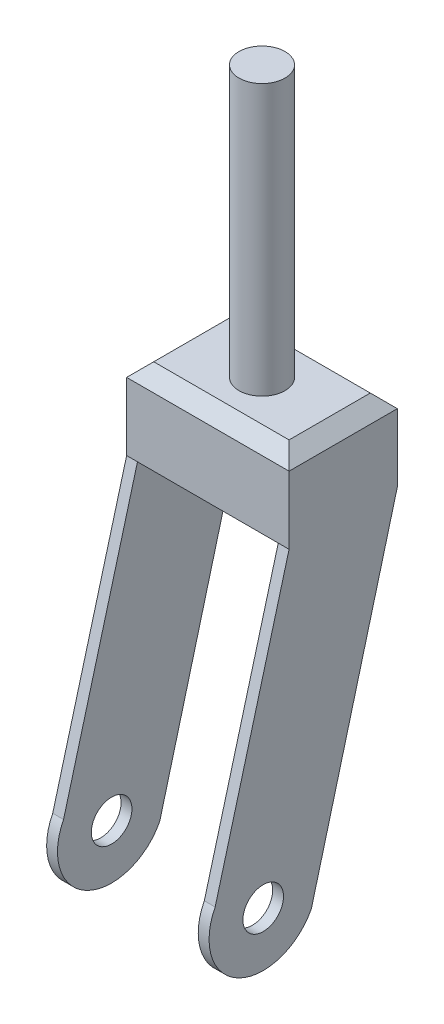
ISO-10303-21;
HEADER;
FILE_DESCRIPTION(('STEP AP214'),'2;1');
FILE_NAME('part.step','',(''),(''),'','','');
FILE_SCHEMA(('AUTOMOTIVE_DESIGN { 1 0 10303 214 1 1 1 1 }'));
ENDSEC;
DATA;
#1=APPLICATION_CONTEXT('core data for automotive mechanical design processes');
#2=APPLICATION_PROTOCOL_DEFINITION('international standard','automotive_design',2000,#1);
#3=PRODUCT_CONTEXT('',#1,'mechanical');
#4=PRODUCT('Part','Part','',(#3));
#5=PRODUCT_RELATED_PRODUCT_CATEGORY('part','',(#4));
#6=PRODUCT_DEFINITION_FORMATION('','',#4);
#7=PRODUCT_DEFINITION_CONTEXT('part definition',#1,'design');
#8=PRODUCT_DEFINITION('design','',#6,#7);
#9=PRODUCT_DEFINITION_SHAPE('','',#8);
#10=(LENGTH_UNIT() NAMED_UNIT(*) SI_UNIT(.MILLI.,.METRE.));
#11=(NAMED_UNIT(*) PLANE_ANGLE_UNIT() SI_UNIT($,.RADIAN.));
#12=(NAMED_UNIT(*) SI_UNIT($,.STERADIAN.) SOLID_ANGLE_UNIT());
#13=UNCERTAINTY_MEASURE_WITH_UNIT(LENGTH_MEASURE(1.E-05),#10,'distance_accuracy_value','');
#14=(GEOMETRIC_REPRESENTATION_CONTEXT(3) GLOBAL_UNCERTAINTY_ASSIGNED_CONTEXT((#13)) GLOBAL_UNIT_ASSIGNED_CONTEXT((#10,
#11,#12)) REPRESENTATION_CONTEXT('',''));
#15=CARTESIAN_POINT('',(0.,0.,0.));
#16=DIRECTION('',(0.,0.,1.));
#17=DIRECTION('',(1.,0.,0.));
#18=AXIS2_PLACEMENT_3D('',#15,#16,#17);
#19=CARTESIAN_POINT('',(-30.,-43.7583335370617,-8.10934535902268));
#20=DIRECTION('',(1.,0.,0.));
#21=DIRECTION('',(0.,0.,-1.));
#22=AXIS2_PLACEMENT_3D('',#19,#20,#21);
#23=CYLINDRICAL_SURFACE('',#22,20.);
#24=DIRECTION('',(1.,0.,0.));
#25=VECTOR('',#24,1.);
#26=CARTESIAN_POINT('',(-30.,-52.9685249966109,-25.8624401111623));
#27=LINE('',#26,#25);
#28=CARTESIAN_POINT('',(-30.,-52.9685249966109,-25.8624401111623));
#29=VERTEX_POINT('',#28);
#30=CARTESIAN_POINT('',(-26.,-52.9685249966109,-25.8624401111623));
#31=VERTEX_POINT('',#30);
#32=EDGE_CURVE('E180',#29,#31,#27,.T.);
#33=ORIENTED_EDGE('',*,*,#32,.T.);
#34=CARTESIAN_POINT('',(-26.,-43.7583335370617,-8.10934535902268));
#35=DIRECTION('',(-1.,0.,0.));
#36=DIRECTION('',(0.,-1.,0.));
#37=AXIS2_PLACEMENT_3D('',#34,#35,#36);
#38=CIRCLE('',#37,20.);
#39=CARTESIAN_POINT('',(-26.,-34.5481420775125,9.64374939311694));
#40=VERTEX_POINT('',#39);
#41=EDGE_CURVE('E366',#40,#31,#38,.F.);
#42=ORIENTED_EDGE('',*,*,#41,.F.);
#43=DIRECTION('',(1.,0.,0.));
#44=VECTOR('',#43,1.);
#45=CARTESIAN_POINT('',(-30.,-34.5481420775125,9.64374939311694));
#46=LINE('',#45,#44);
#47=CARTESIAN_POINT('',(-30.,-34.5481420775125,9.64374939311694));
#48=VERTEX_POINT('',#47);
#49=EDGE_CURVE('E203',#48,#40,#46,.T.);
#50=ORIENTED_EDGE('',*,*,#49,.F.);
#51=CARTESIAN_POINT('',(-30.,-43.7583335370617,-8.10934535902268));
#52=DIRECTION('',(1.,0.,0.));
#53=DIRECTION('',(0.,0.,-1.));
#54=AXIS2_PLACEMENT_3D('',#51,#52,#53);
#55=CIRCLE('',#54,20.);
#56=EDGE_CURVE('E336',#48,#29,#55,.T.);
#57=ORIENTED_EDGE('',*,*,#56,.T.);
#58=EDGE_LOOP('',(#33,#42,#50,#57));
#59=FACE_BOUND('',#58,.T.);
#60=ADVANCED_FACE('F47',(#59),#23,.T.);
#61=CARTESIAN_POINT('',(-30.,-34.5481420775125,9.64374939311694));
#62=DIRECTION('',(0.,0.261495189546313,0.965204779227775));
#63=DIRECTION('',(0.,-0.965204779227775,0.261495189546313));
#64=AXIS2_PLACEMENT_3D('',#61,#62,#63);
#65=PLANE('',#64);
#66=DIRECTION('',(0.,0.965204779227775,-0.261495189546313));
#67=VECTOR('',#66,1.);
#68=CARTESIAN_POINT('',(26.,-34.5481420775125,9.64374939311694));
#69=LINE('',#68,#67);
#70=CARTESIAN_POINT('',(26.,-34.5481420775125,9.64374939311694));
#71=VERTEX_POINT('',#70);
#72=CARTESIAN_POINT('',(26.,66.2416664629383,-17.6624250641918));
#73=VERTEX_POINT('',#72);
#74=EDGE_CURVE('E150',#71,#73,#69,.T.);
#75=ORIENTED_EDGE('',*,*,#74,.F.);
#76=CARTESIAN_POINT('',(30.,-34.5481420775125,9.64374939311694));
#77=VERTEX_POINT('',#76);
#78=EDGE_CURVE('E307',#71,#77,#46,.T.);
#79=ORIENTED_EDGE('',*,*,#78,.T.);
#80=DIRECTION('',(0.,-0.965204779227775,0.261495189546313));
#81=VECTOR('',#80,1.);
#82=CARTESIAN_POINT('',(30.,-34.5481420775125,9.64374939311694));
#83=LINE('',#82,#81);
#84=CARTESIAN_POINT('',(30.,66.2416664629383,-17.6624250641918));
#85=VERTEX_POINT('',#84);
#86=EDGE_CURVE('E261',#85,#77,#83,.T.);
#87=ORIENTED_EDGE('',*,*,#86,.F.);
#88=DIRECTION('',(1.,0.,0.));
#89=VECTOR('',#88,1.);
#90=CARTESIAN_POINT('',(-30.,66.2416664629383,-17.6624250641918));
#91=LINE('',#90,#89);
#92=EDGE_CURVE('E184',#73,#85,#91,.T.);
#93=ORIENTED_EDGE('',*,*,#92,.F.);
#94=EDGE_LOOP('',(#75,#79,#87,#93));
#95=FACE_BOUND('',#94,.T.);
#96=ADVANCED_FACE('F283',(#95),#65,.T.);
#97=CARTESIAN_POINT('',(-30.,-52.9685249966109,-25.8624401111623));
#98=DIRECTION('',(0.,-0.257742864411782,-0.966213545674459));
#99=DIRECTION('',(0.,0.966213545674459,-0.257742864411782));
#100=AXIS2_PLACEMENT_3D('',#97,#98,#99);
#101=PLANE('',#100);
#102=DIRECTION('',(0.,-0.966213545674459,0.257742864411782));
#103=VECTOR('',#102,1.);
#104=CARTESIAN_POINT('',(26.,-52.9685249966109,-25.8624401111623));
#105=LINE('',#104,#103);
#106=CARTESIAN_POINT('',(26.,66.2416664629383,-57.6624250641918));
#107=VERTEX_POINT('',#106);
#108=CARTESIAN_POINT('',(26.,-52.9685249966109,-25.8624401111623));
#109=VERTEX_POINT('',#108);
#110=EDGE_CURVE('E147',#107,#109,#105,.T.);
#111=ORIENTED_EDGE('',*,*,#110,.F.);
#112=DIRECTION('',(1.,0.,0.));
#113=VECTOR('',#112,1.);
#114=CARTESIAN_POINT('',(-30.,66.2416664629383,-57.6624250641918));
#115=LINE('',#114,#113);
#116=CARTESIAN_POINT('',(30.,66.2416664629383,-57.6624250641918));
#117=VERTEX_POINT('',#116);
#118=EDGE_CURVE('E169',#107,#117,#115,.T.);
#119=ORIENTED_EDGE('',*,*,#118,.T.);
#120=DIRECTION('',(0.,0.966213545674459,-0.257742864411782));
#121=VECTOR('',#120,1.);
#122=CARTESIAN_POINT('',(30.,-52.9685249966109,-25.8624401111623));
#123=LINE('',#122,#121);
#124=CARTESIAN_POINT('',(30.,-52.9685249966109,-25.8624401111623));
#125=VERTEX_POINT('',#124);
#126=EDGE_CURVE('E325',#125,#117,#123,.T.);
#127=ORIENTED_EDGE('',*,*,#126,.F.);
#128=EDGE_CURVE('E171',#109,#125,#27,.T.);
#129=ORIENTED_EDGE('',*,*,#128,.F.);
#130=EDGE_LOOP('',(#111,#119,#127,#129));
#131=FACE_BOUND('',#130,.T.);
#132=ADVANCED_FACE('F167',(#131),#101,.T.);
#133=CARTESIAN_POINT('',(-30.,-43.7583335370617,-8.10934535902268));
#134=DIRECTION('',(1.,0.,0.));
#135=DIRECTION('',(0.,0.,-1.));
#136=AXIS2_PLACEMENT_3D('',#133,#134,#135);
#137=CYLINDRICAL_SURFACE('',#136,7.5);
#138=CARTESIAN_POINT('',(26.,-43.7583335370617,-8.10934535902268));
#139=DIRECTION('',(1.,0.,0.));
#140=DIRECTION('',(0.,1.,0.));
#141=AXIS2_PLACEMENT_3D('',#138,#139,#140);
#142=CIRCLE('',#141,7.5);
#143=CARTESIAN_POINT('',(26.,-36.2583335370617,-8.10934535902268));
#144=VERTEX_POINT('',#143);
#145=EDGE_CURVE('E174',#144,#144,#142,.F.);
#146=ORIENTED_EDGE('',*,*,#145,.T.);
#147=EDGE_LOOP('',(#146));
#148=FACE_BOUND('',#147,.T.);
#149=CARTESIAN_POINT('',(30.,-43.7583335370617,-8.10934535902268));
#150=DIRECTION('',(1.,0.,0.));
#151=DIRECTION('',(0.,0.,-1.));
#152=AXIS2_PLACEMENT_3D('',#149,#150,#151);
#153=CIRCLE('',#152,7.5);
#154=CARTESIAN_POINT('',(30.,-43.7583335370617,-15.6093453590227));
#155=VERTEX_POINT('',#154);
#156=EDGE_CURVE('E317',#155,#155,#153,.T.);
#157=ORIENTED_EDGE('',*,*,#156,.T.);
#158=EDGE_LOOP('',(#157));
#159=FACE_BOUND('',#158,.T.);
#160=ADVANCED_FACE('F295',(#148,#159),#137,.F.);
#161=CARTESIAN_POINT('',(26.,-43.7583335370617,-8.10934535902268));
#162=DIRECTION('',(1.,0.,0.));
#163=DIRECTION('',(0.,1.,0.));
#164=AXIS2_PLACEMENT_3D('',#161,#162,#163);
#165=CIRCLE('',#164,20.);
#166=EDGE_CURVE('E173',#109,#71,#165,.F.);
#167=ORIENTED_EDGE('',*,*,#166,.F.);
#168=ORIENTED_EDGE('',*,*,#128,.T.);
#169=CARTESIAN_POINT('',(30.,-43.7583335370617,-8.10934535902268));
#170=DIRECTION('',(1.,0.,0.));
#171=DIRECTION('',(0.,0.,-1.));
#172=AXIS2_PLACEMENT_3D('',#169,#170,#171);
#173=CIRCLE('',#172,20.);
#174=EDGE_CURVE('E321',#77,#125,#173,.T.);
#175=ORIENTED_EDGE('',*,*,#174,.F.);
#176=ORIENTED_EDGE('',*,*,#78,.F.);
#177=EDGE_LOOP('',(#167,#168,#175,#176));
#178=FACE_BOUND('',#177,.T.);
#179=ADVANCED_FACE('F286',(#178),#23,.T.);
#180=DIRECTION('',(0.,-0.965204779227775,0.261495189546313));
#181=VECTOR('',#180,1.);
#182=CARTESIAN_POINT('',(-26.,-34.5481420775125,9.64374939311694));
#183=LINE('',#182,#181);
#184=CARTESIAN_POINT('',(-26.,66.2416664629383,-17.6624250641918));
#185=VERTEX_POINT('',#184);
#186=EDGE_CURVE('E198',#185,#40,#183,.T.);
#187=ORIENTED_EDGE('',*,*,#186,.F.);
#188=CARTESIAN_POINT('',(-30.,66.2416664629383,-17.6624250641918));
#189=VERTEX_POINT('',#188);
#190=EDGE_CURVE('E188',#189,#185,#91,.T.);
#191=ORIENTED_EDGE('',*,*,#190,.F.);
#192=DIRECTION('',(0.,-0.965204779227775,0.261495189546313));
#193=VECTOR('',#192,1.);
#194=CARTESIAN_POINT('',(-30.,-34.5481420775125,9.64374939311694));
#195=LINE('',#194,#193);
#196=EDGE_CURVE('E350',#189,#48,#195,.T.);
#197=ORIENTED_EDGE('',*,*,#196,.T.);
#198=ORIENTED_EDGE('',*,*,#49,.T.);
#199=EDGE_LOOP('',(#187,#191,#197,#198));
#200=FACE_BOUND('',#199,.T.);
#201=ADVANCED_FACE('F279',(#200),#65,.T.);
#202=CARTESIAN_POINT('',(-30.,66.2416664629383,-17.6624250641918));
#203=DIRECTION('',(0.,0.,1.));
#204=DIRECTION('',(1.,0.,0.));
#205=AXIS2_PLACEMENT_3D('',#202,#203,#204);
#206=PLANE('',#205);
#207=DIRECTION('',(0.,-1.,0.));
#208=VECTOR('',#207,1.);
#209=CARTESIAN_POINT('',(30.,66.2416664629383,-17.6624250641918));
#210=LINE('',#209,#208);
#211=CARTESIAN_POINT('',(30.,91.2416664629383,-17.6624250641918));
#212=VERTEX_POINT('',#211);
#213=EDGE_CURVE('E253',#212,#85,#210,.T.);
#214=ORIENTED_EDGE('',*,*,#213,.F.);
#215=DIRECTION('',(-1.,0.,0.));
#216=VECTOR('',#215,1.);
#217=CARTESIAN_POINT('',(-30.,91.2416664629383,-17.6624250641918));
#218=LINE('',#217,#216);
#219=CARTESIAN_POINT('',(-30.,91.2416664629383,-17.6624250641918));
#220=VERTEX_POINT('',#219);
#221=EDGE_CURVE('E213',#212,#220,#218,.T.);
#222=ORIENTED_EDGE('',*,*,#221,.T.);
#223=DIRECTION('',(0.,-1.,0.));
#224=VECTOR('',#223,1.);
#225=CARTESIAN_POINT('',(-30.,66.2416664629383,-17.6624250641918));
#226=LINE('',#225,#224);
#227=EDGE_CURVE('E347',#220,#189,#226,.T.);
#228=ORIENTED_EDGE('',*,*,#227,.T.);
#229=ORIENTED_EDGE('',*,*,#190,.T.);
#230=DIRECTION('',(-1.,0.,0.));
#231=VECTOR('',#230,1.);
#232=CARTESIAN_POINT('',(-30.,66.2416664629383,-17.6624250641918));
#233=LINE('',#232,#231);
#234=EDGE_CURVE('E311',#73,#185,#233,.T.);
#235=ORIENTED_EDGE('',*,*,#234,.F.);
#236=ORIENTED_EDGE('',*,*,#92,.T.);
#237=EDGE_LOOP('',(#214,#222,#228,#229,#235,#236));
#238=FACE_BOUND('',#237,.T.);
#239=ADVANCED_FACE('F257',(#238),#206,.T.);
#240=CARTESIAN_POINT('',(-30.,96.2416664629383,-17.6624250641918));
#241=DIRECTION('',(0.,1.,0.));
#242=DIRECTION('',(0.,0.,1.));
#243=AXIS2_PLACEMENT_3D('',#240,#241,#242);
#244=PLANE('',#243);
#245=CARTESIAN_POINT('',(0.,96.2416664629383,-37.6624250641918));
#246=DIRECTION('',(0.,1.,0.));
#247=DIRECTION('',(0.,0.,1.));
#248=AXIS2_PLACEMENT_3D('',#245,#246,#247);
#249=CIRCLE('',#248,8.5);
#250=CARTESIAN_POINT('',(0.,96.2416664629383,-29.1624250641918));
#251=VERTEX_POINT('',#250);
#252=EDGE_CURVE('E11',#251,#251,#249,.T.);
#253=ORIENTED_EDGE('',*,*,#252,.F.);
#254=EDGE_LOOP('',(#253));
#255=FACE_BOUND('',#254,.T.);
#256=DIRECTION('',(0.,0.,1.));
#257=VECTOR('',#256,1.);
#258=CARTESIAN_POINT('',(-25.,96.2416664629383,-17.6624250641918));
#259=LINE('',#258,#257);
#260=CARTESIAN_POINT('',(-25.,96.2416664629383,-52.6624250641918));
#261=VERTEX_POINT('',#260);
#262=CARTESIAN_POINT('',(-25.,96.2416664629383,-22.6624250641918));
#263=VERTEX_POINT('',#262);
#264=EDGE_CURVE('E206',#261,#263,#259,.T.);
#265=ORIENTED_EDGE('',*,*,#264,.T.);
#266=DIRECTION('',(1.,0.,0.));
#267=VECTOR('',#266,1.);
#268=CARTESIAN_POINT('',(-30.,96.2416664629383,-22.6624250641918));
#269=LINE('',#268,#267);
#270=CARTESIAN_POINT('',(25.,96.2416664629383,-22.6624250641918));
#271=VERTEX_POINT('',#270);
#272=EDGE_CURVE('E209',#263,#271,#269,.T.);
#273=ORIENTED_EDGE('',*,*,#272,.T.);
#274=DIRECTION('',(0.,0.,-1.));
#275=VECTOR('',#274,1.);
#276=CARTESIAN_POINT('',(25.,96.2416664629383,-17.6624250641918));
#277=LINE('',#276,#275);
#278=CARTESIAN_POINT('',(25.,96.2416664629383,-52.6624250641918));
#279=VERTEX_POINT('',#278);
#280=EDGE_CURVE('E202',#271,#279,#277,.T.);
#281=ORIENTED_EDGE('',*,*,#280,.T.);
#282=DIRECTION('',(-1.,0.,0.));
#283=VECTOR('',#282,1.);
#284=CARTESIAN_POINT('',(-30.,96.2416664629383,-52.6624250641918));
#285=LINE('',#284,#283);
#286=EDGE_CURVE('E199',#279,#261,#285,.T.);
#287=ORIENTED_EDGE('',*,*,#286,.T.);
#288=EDGE_LOOP('',(#265,#273,#281,#287));
#289=FACE_BOUND('',#288,.T.);
#290=ADVANCED_FACE('F267',(#255,#289),#244,.T.);
#291=CARTESIAN_POINT('',(-30.,96.2416664629383,-57.6624250641918));
#292=DIRECTION('',(0.,0.,-1.));
#293=DIRECTION('',(0.,1.,0.));
#294=AXIS2_PLACEMENT_3D('',#291,#292,#293);
#295=PLANE('',#294);
#296=DIRECTION('',(0.,1.,0.));
#297=VECTOR('',#296,1.);
#298=CARTESIAN_POINT('',(-30.,96.2416664629383,-57.6624250641918));
#299=LINE('',#298,#297);
#300=CARTESIAN_POINT('',(-30.,66.2416664629383,-57.6624250641918));
#301=VERTEX_POINT('',#300);
#302=CARTESIAN_POINT('',(-30.,91.2416664629383,-57.6624250641918));
#303=VERTEX_POINT('',#302);
#304=EDGE_CURVE('E344',#301,#303,#299,.T.);
#305=ORIENTED_EDGE('',*,*,#304,.T.);
#306=DIRECTION('',(1.,0.,0.));
#307=VECTOR('',#306,1.);
#308=CARTESIAN_POINT('',(-30.,91.2416664629383,-57.6624250641918));
#309=LINE('',#308,#307);
#310=CARTESIAN_POINT('',(30.,91.2416664629383,-57.6624250641918));
#311=VERTEX_POINT('',#310);
#312=EDGE_CURVE('E58',#303,#311,#309,.T.);
#313=ORIENTED_EDGE('',*,*,#312,.T.);
#314=DIRECTION('',(0.,1.,0.));
#315=VECTOR('',#314,1.);
#316=CARTESIAN_POINT('',(30.,96.2416664629383,-57.6624250641918));
#317=LINE('',#316,#315);
#318=EDGE_CURVE('E177',#117,#311,#317,.T.);
#319=ORIENTED_EDGE('',*,*,#318,.F.);
#320=ORIENTED_EDGE('',*,*,#118,.F.);
#321=DIRECTION('',(1.,0.,0.));
#322=VECTOR('',#321,1.);
#323=CARTESIAN_POINT('',(26.,66.2416664629383,-57.6624250641918));
#324=LINE('',#323,#322);
#325=CARTESIAN_POINT('',(-26.,66.2416664629383,-57.6624250641918));
#326=VERTEX_POINT('',#325);
#327=EDGE_CURVE('E158',#326,#107,#324,.T.);
#328=ORIENTED_EDGE('',*,*,#327,.F.);
#329=EDGE_CURVE('E179',#301,#326,#115,.T.);
#330=ORIENTED_EDGE('',*,*,#329,.F.);
#331=EDGE_LOOP('',(#305,#313,#319,#320,#328,#330));
#332=FACE_BOUND('',#331,.T.);
#333=ADVANCED_FACE('F176',(#332),#295,.T.);
#334=DIRECTION('',(0.,0.966213545674459,-0.257742864411782));
#335=VECTOR('',#334,1.);
#336=CARTESIAN_POINT('',(-26.,-52.9685249966109,-25.8624401111623));
#337=LINE('',#336,#335);
#338=EDGE_CURVE('E194',#31,#326,#337,.T.);
#339=ORIENTED_EDGE('',*,*,#338,.F.);
#340=ORIENTED_EDGE('',*,*,#32,.F.);
#341=DIRECTION('',(0.,0.966213545674459,-0.257742864411782));
#342=VECTOR('',#341,1.);
#343=CARTESIAN_POINT('',(-30.,-52.9685249966109,-25.8624401111623));
#344=LINE('',#343,#342);
#345=EDGE_CURVE('E340',#29,#301,#344,.T.);
#346=ORIENTED_EDGE('',*,*,#345,.T.);
#347=ORIENTED_EDGE('',*,*,#329,.T.);
#348=EDGE_LOOP('',(#339,#340,#346,#347));
#349=FACE_BOUND('',#348,.T.);
#350=ADVANCED_FACE('F276',(#349),#101,.T.);
#351=CARTESIAN_POINT('',(-30.,-43.7583335370617,-8.10934535902268));
#352=DIRECTION('',(1.,0.,0.));
#353=DIRECTION('',(0.,0.,-1.));
#354=AXIS2_PLACEMENT_3D('',#351,#352,#353);
#355=PLANE('',#354);
#356=CARTESIAN_POINT('',(-30.,-43.7583335370617,-8.10934535902268));
#357=DIRECTION('',(1.,0.,0.));
#358=DIRECTION('',(0.,0.,-1.));
#359=AXIS2_PLACEMENT_3D('',#356,#357,#358);
#360=CIRCLE('',#359,7.5);
#361=CARTESIAN_POINT('',(-30.,-43.7583335370617,-15.6093453590227));
#362=VERTEX_POINT('',#361);
#363=EDGE_CURVE('E332',#362,#362,#360,.T.);
#364=ORIENTED_EDGE('',*,*,#363,.T.);
#365=EDGE_LOOP('',(#364));
#366=FACE_BOUND('',#365,.T.);
#367=ORIENTED_EDGE('',*,*,#227,.F.);
#368=DIRECTION('',(0.,0.,-1.));
#369=VECTOR('',#368,1.);
#370=CARTESIAN_POINT('',(-30.,91.2416664629383,-57.6624250641918));
#371=LINE('',#370,#369);
#372=EDGE_CURVE('E73',#220,#303,#371,.T.);
#373=ORIENTED_EDGE('',*,*,#372,.T.);
#374=ORIENTED_EDGE('',*,*,#304,.F.);
#375=ORIENTED_EDGE('',*,*,#345,.F.);
#376=ORIENTED_EDGE('',*,*,#56,.F.);
#377=ORIENTED_EDGE('',*,*,#196,.F.);
#378=EDGE_LOOP('',(#367,#373,#374,#375,#376,#377));
#379=FACE_BOUND('',#378,.T.);
#380=ADVANCED_FACE('F363',(#366,#379),#355,.F.);
#381=CARTESIAN_POINT('',(-26.,-43.7583335370617,-8.10934535902268));
#382=DIRECTION('',(-1.,0.,0.));
#383=DIRECTION('',(0.,-1.,0.));
#384=AXIS2_PLACEMENT_3D('',#381,#382,#383);
#385=CIRCLE('',#384,7.5);
#386=CARTESIAN_POINT('',(-26.,-51.2583335370617,-8.10934535902268));
#387=VERTEX_POINT('',#386);
#388=EDGE_CURVE('E154',#387,#387,#385,.F.);
#389=ORIENTED_EDGE('',*,*,#388,.T.);
#390=EDGE_LOOP('',(#389));
#391=FACE_BOUND('',#390,.T.);
#392=ORIENTED_EDGE('',*,*,#363,.F.);
#393=EDGE_LOOP('',(#392));
#394=FACE_BOUND('',#393,.T.);
#395=ADVANCED_FACE('F304',(#391,#394),#137,.F.);
#396=CARTESIAN_POINT('',(30.,-43.7583335370617,-8.10934535902268));
#397=DIRECTION('',(1.,0.,0.));
#398=DIRECTION('',(0.,0.,-1.));
#399=AXIS2_PLACEMENT_3D('',#396,#397,#398);
#400=PLANE('',#399);
#401=ORIENTED_EDGE('',*,*,#318,.T.);
#402=DIRECTION('',(0.,0.,1.));
#403=VECTOR('',#402,1.);
#404=CARTESIAN_POINT('',(30.,91.2416664629383,-8.10934535902268));
#405=LINE('',#404,#403);
#406=EDGE_CURVE('E219',#311,#212,#405,.T.);
#407=ORIENTED_EDGE('',*,*,#406,.T.);
#408=ORIENTED_EDGE('',*,*,#213,.T.);
#409=ORIENTED_EDGE('',*,*,#86,.T.);
#410=ORIENTED_EDGE('',*,*,#174,.T.);
#411=ORIENTED_EDGE('',*,*,#126,.T.);
#412=EDGE_LOOP('',(#401,#407,#408,#409,#410,#411));
#413=FACE_BOUND('',#412,.T.);
#414=ORIENTED_EDGE('',*,*,#156,.F.);
#415=EDGE_LOOP('',(#414));
#416=FACE_BOUND('',#415,.T.);
#417=ADVANCED_FACE('F250',(#413,#416),#400,.T.);
#418=CARTESIAN_POINT('',(26.,66.2416664629383,11.8906546409773));
#419=DIRECTION('',(1.,0.,0.));
#420=DIRECTION('',(0.,1.,0.));
#421=AXIS2_PLACEMENT_3D('',#418,#419,#420);
#422=PLANE('',#421);
#423=ORIENTED_EDGE('',*,*,#74,.T.);
#424=DIRECTION('',(0.,0.,-1.));
#425=VECTOR('',#424,1.);
#426=CARTESIAN_POINT('',(26.,66.2416664629383,11.8906546409773));
#427=LINE('',#426,#425);
#428=EDGE_CURVE('E142',#73,#107,#427,.T.);
#429=ORIENTED_EDGE('',*,*,#428,.T.);
#430=ORIENTED_EDGE('',*,*,#110,.T.);
#431=ORIENTED_EDGE('',*,*,#166,.T.);
#432=EDGE_LOOP('',(#423,#429,#430,#431));
#433=FACE_BOUND('',#432,.T.);
#434=ORIENTED_EDGE('',*,*,#145,.F.);
#435=EDGE_LOOP('',(#434));
#436=FACE_BOUND('',#435,.T.);
#437=ADVANCED_FACE('F144',(#433,#436),#422,.F.);
#438=CARTESIAN_POINT('',(-26.,66.2416664629383,11.8906546409773));
#439=DIRECTION('',(-1.,0.,0.));
#440=DIRECTION('',(0.,-1.,0.));
#441=AXIS2_PLACEMENT_3D('',#438,#439,#440);
#442=PLANE('',#441);
#443=ORIENTED_EDGE('',*,*,#186,.T.);
#444=ORIENTED_EDGE('',*,*,#41,.T.);
#445=ORIENTED_EDGE('',*,*,#338,.T.);
#446=DIRECTION('',(0.,0.,-1.));
#447=VECTOR('',#446,1.);
#448=CARTESIAN_POINT('',(-26.,66.2416664629383,11.8906546409773));
#449=LINE('',#448,#447);
#450=EDGE_CURVE('E155',#185,#326,#449,.T.);
#451=ORIENTED_EDGE('',*,*,#450,.F.);
#452=EDGE_LOOP('',(#443,#444,#445,#451));
#453=FACE_BOUND('',#452,.T.);
#454=ORIENTED_EDGE('',*,*,#388,.F.);
#455=EDGE_LOOP('',(#454));
#456=FACE_BOUND('',#455,.T.);
#457=ADVANCED_FACE('F393',(#453,#456),#442,.F.);
#458=CARTESIAN_POINT('',(26.,66.2416664629383,11.8906546409773));
#459=DIRECTION('',(0.,1.,0.));
#460=DIRECTION('',(0.,0.,1.));
#461=AXIS2_PLACEMENT_3D('',#458,#459,#460);
#462=PLANE('',#461);
#463=ORIENTED_EDGE('',*,*,#234,.T.);
#464=ORIENTED_EDGE('',*,*,#450,.T.);
#465=ORIENTED_EDGE('',*,*,#327,.T.);
#466=ORIENTED_EDGE('',*,*,#428,.F.);
#467=EDGE_LOOP('',(#463,#464,#465,#466));
#468=FACE_BOUND('',#467,.T.);
#469=ADVANCED_FACE('F159',(#468),#462,.F.);
#470=CARTESIAN_POINT('',(-30.,91.2416664629383,-57.6624250641918));
#471=DIRECTION('',(0.,-0.707106781186549,0.707106781186546));
#472=DIRECTION('',(1.,0.,0.));
#473=AXIS2_PLACEMENT_3D('',#470,#471,#472);
#474=PLANE('',#473);
#475=DIRECTION('',(0.577350269189626,-0.577350269189624,-0.577350269189627));
#476=VECTOR('',#475,1.);
#477=CARTESIAN_POINT('',(9.99999999999999,111.241666462938,-37.6624250641918));
#478=LINE('',#477,#476);
#479=EDGE_CURVE('E230',#311,#279,#478,.F.);
#480=ORIENTED_EDGE('',*,*,#479,.F.);
#481=ORIENTED_EDGE('',*,*,#312,.F.);
#482=DIRECTION('',(-0.577350269189626,-0.577350269189624,-0.577350269189627));
#483=VECTOR('',#482,1.);
#484=CARTESIAN_POINT('',(-30.,91.2416664629383,-57.6624250641918));
#485=LINE('',#484,#483);
#486=EDGE_CURVE('E52',#261,#303,#485,.T.);
#487=ORIENTED_EDGE('',*,*,#486,.F.);
#488=ORIENTED_EDGE('',*,*,#286,.F.);
#489=EDGE_LOOP('',(#480,#481,#487,#488));
#490=FACE_BOUND('',#489,.T.);
#491=ADVANCED_FACE('F50',(#490),#474,.F.);
#492=CARTESIAN_POINT('',(-25.,96.2416664629383,-17.6624250641918));
#493=DIRECTION('',(-0.707106781186546,0.707106781186548,0.));
#494=DIRECTION('',(0.,0.,-1.));
#495=AXIS2_PLACEMENT_3D('',#492,#493,#494);
#496=PLANE('',#495);
#497=ORIENTED_EDGE('',*,*,#486,.T.);
#498=ORIENTED_EDGE('',*,*,#372,.F.);
#499=DIRECTION('',(-0.577350269189626,-0.577350269189624,0.577350269189627));
#500=VECTOR('',#499,1.);
#501=CARTESIAN_POINT('',(-26.6666666666667,94.5749997962716,-20.9957583975252));
#502=LINE('',#501,#500);
#503=EDGE_CURVE('E227',#263,#220,#502,.T.);
#504=ORIENTED_EDGE('',*,*,#503,.F.);
#505=ORIENTED_EDGE('',*,*,#264,.F.);
#506=EDGE_LOOP('',(#497,#498,#504,#505));
#507=FACE_BOUND('',#506,.T.);
#508=ADVANCED_FACE('F242',(#507),#496,.T.);
#509=CARTESIAN_POINT('',(30.,91.2416664629383,-8.10934535902268));
#510=DIRECTION('',(-0.707106781186546,-0.707106781186548,0.));
#511=DIRECTION('',(0.,0.,1.));
#512=AXIS2_PLACEMENT_3D('',#509,#510,#511);
#513=PLANE('',#512);
#514=ORIENTED_EDGE('',*,*,#479,.T.);
#515=ORIENTED_EDGE('',*,*,#280,.F.);
#516=DIRECTION('',(0.577350269189626,-0.577350269189624,0.577350269189627));
#517=VECTOR('',#516,1.);
#518=CARTESIAN_POINT('',(33.1843599017231,88.0573065612153,-14.4780651624688));
#519=LINE('',#518,#517);
#520=EDGE_CURVE('E224',#212,#271,#519,.F.);
#521=ORIENTED_EDGE('',*,*,#520,.F.);
#522=ORIENTED_EDGE('',*,*,#406,.F.);
#523=EDGE_LOOP('',(#514,#515,#521,#522));
#524=FACE_BOUND('',#523,.T.);
#525=ADVANCED_FACE('F247',(#524),#513,.F.);
#526=CARTESIAN_POINT('',(-30.,96.2416664629383,-22.6624250641918));
#527=DIRECTION('',(0.,-0.707106781186549,-0.707106781186546));
#528=DIRECTION('',(1.,0.,0.));
#529=AXIS2_PLACEMENT_3D('',#526,#527,#528);
#530=PLANE('',#529);
#531=ORIENTED_EDGE('',*,*,#503,.T.);
#532=ORIENTED_EDGE('',*,*,#221,.F.);
#533=ORIENTED_EDGE('',*,*,#520,.T.);
#534=ORIENTED_EDGE('',*,*,#272,.F.);
#535=EDGE_LOOP('',(#531,#532,#533,#534));
#536=FACE_BOUND('',#535,.T.);
#537=ADVANCED_FACE('F264',(#536),#530,.F.);
#538=CARTESIAN_POINT('',(0.,196.241666462938,-37.6624250641918));
#539=DIRECTION('',(0.,-1.,0.));
#540=DIRECTION('',(0.,0.,-1.));
#541=AXIS2_PLACEMENT_3D('',#538,#539,#540);
#542=CYLINDRICAL_SURFACE('',#541,8.5);
#543=CARTESIAN_POINT('',(0.,196.241666462938,-37.6624250641918));
#544=DIRECTION('',(0.,1.,0.));
#545=DIRECTION('',(0.,0.,1.));
#546=AXIS2_PLACEMENT_3D('',#543,#544,#545);
#547=CIRCLE('',#546,8.5);
#548=CARTESIAN_POINT('',(0.,196.241666462938,-29.1624250641918));
#549=VERTEX_POINT('',#548);
#550=EDGE_CURVE('E228',#549,#549,#547,.T.);
#551=ORIENTED_EDGE('',*,*,#550,.F.);
#552=EDGE_LOOP('',(#551));
#553=FACE_BOUND('',#552,.T.);
#554=ORIENTED_EDGE('',*,*,#252,.T.);
#555=EDGE_LOOP('',(#554));
#556=FACE_BOUND('',#555,.T.);
#557=ADVANCED_FACE('F383',(#553,#556),#542,.T.);
#558=CARTESIAN_POINT('',(0.,196.241666462938,-37.6624250641918));
#559=DIRECTION('',(0.,1.,0.));
#560=DIRECTION('',(0.,0.,1.));
#561=AXIS2_PLACEMENT_3D('',#558,#559,#560);
#562=PLANE('',#561);
#563=ORIENTED_EDGE('',*,*,#550,.T.);
#564=EDGE_LOOP('',(#563));
#565=FACE_BOUND('',#564,.T.);
#566=ADVANCED_FACE('F381',(#565),#562,.T.);
#567=CLOSED_SHELL('',(#60,#96,#132,#160,#179,#201,#239,#290,#333,#350,#380,#395,#417,#437,#457,
#469,#491,#508,#525,#537,#557,#566));
#568=MANIFOLD_SOLID_BREP('B2',#567);
#569=ADVANCED_BREP_SHAPE_REPRESENTATION('',(#18,#568),#14);
#570=SHAPE_DEFINITION_REPRESENTATION(#9,#569);
ENDSEC;
END-ISO-10303-21;
